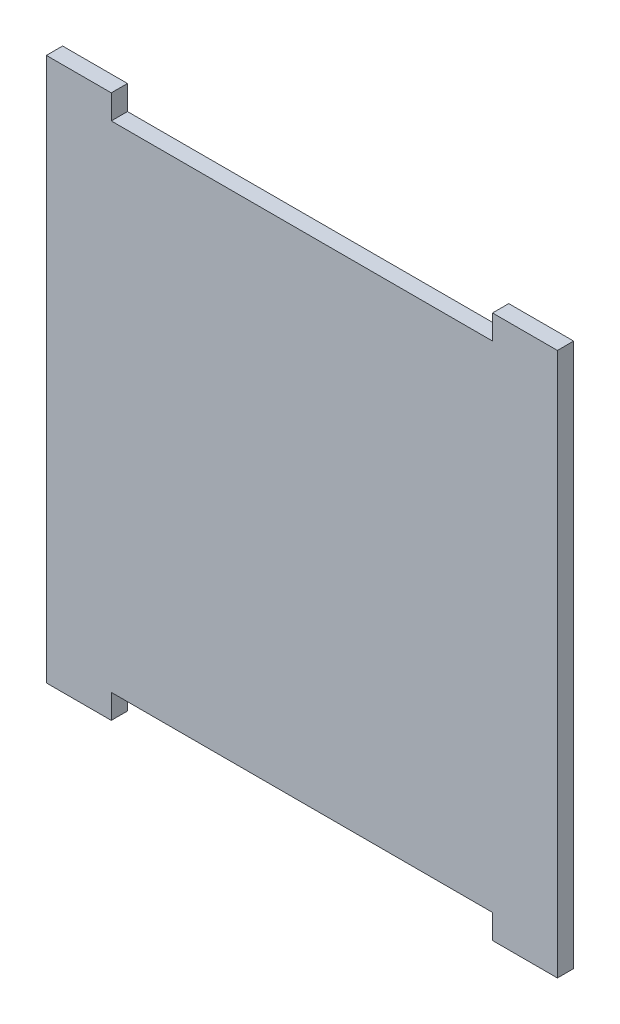
ISO-10303-21;
HEADER;
FILE_DESCRIPTION(('STEP AP214'),'2;1');
FILE_NAME('part.step','',(''),(''),'','','');
FILE_SCHEMA(('AUTOMOTIVE_DESIGN { 1 0 10303 214 1 1 1 1 }'));
ENDSEC;
DATA;
#1=APPLICATION_CONTEXT('core data for automotive mechanical design processes');
#2=APPLICATION_PROTOCOL_DEFINITION('international standard','automotive_design',2000,#1);
#3=PRODUCT_CONTEXT('',#1,'mechanical');
#4=PRODUCT('Part','Part','',(#3));
#5=PRODUCT_RELATED_PRODUCT_CATEGORY('part','',(#4));
#6=PRODUCT_DEFINITION_FORMATION('','',#4);
#7=PRODUCT_DEFINITION_CONTEXT('part definition',#1,'design');
#8=PRODUCT_DEFINITION('design','',#6,#7);
#9=PRODUCT_DEFINITION_SHAPE('','',#8);
#10=(LENGTH_UNIT() NAMED_UNIT(*) SI_UNIT(.MILLI.,.METRE.));
#11=(NAMED_UNIT(*) PLANE_ANGLE_UNIT() SI_UNIT($,.RADIAN.));
#12=(NAMED_UNIT(*) SI_UNIT($,.STERADIAN.) SOLID_ANGLE_UNIT());
#13=UNCERTAINTY_MEASURE_WITH_UNIT(LENGTH_MEASURE(1.E-05),#10,'distance_accuracy_value','');
#14=(GEOMETRIC_REPRESENTATION_CONTEXT(3) GLOBAL_UNCERTAINTY_ASSIGNED_CONTEXT((#13)) GLOBAL_UNIT_ASSIGNED_CONTEXT((#10,
#11,#12)) REPRESENTATION_CONTEXT('',''));
#15=CARTESIAN_POINT('',(0.,0.,0.));
#16=DIRECTION('',(0.,0.,1.));
#17=DIRECTION('',(1.,0.,0.));
#18=AXIS2_PLACEMENT_3D('',#15,#16,#17);
#19=CARTESIAN_POINT('',(-93.6625,106.3625,6.35));
#20=DIRECTION('',(0.,-1.,0.));
#21=DIRECTION('',(0.,0.,-1.));
#22=AXIS2_PLACEMENT_3D('',#19,#20,#21);
#23=PLANE('',#22);
#24=DIRECTION('',(0.,0.,1.));
#25=VECTOR('',#24,1.);
#26=CARTESIAN_POINT('',(-68.2625,106.3625,-0.00100000000000013));
#27=LINE('',#26,#25);
#28=CARTESIAN_POINT('',(-68.2625,106.3625,0.));
#29=VERTEX_POINT('',#28);
#30=CARTESIAN_POINT('',(-68.2625,106.3625,6.35));
#31=VERTEX_POINT('',#30);
#32=EDGE_CURVE('E138',#29,#31,#27,.T.);
#33=ORIENTED_EDGE('',*,*,#32,.F.);
#34=DIRECTION('',(-1.,0.,0.));
#35=VECTOR('',#34,1.);
#36=CARTESIAN_POINT('',(-93.6625,106.3625,0.));
#37=LINE('',#36,#35);
#38=CARTESIAN_POINT('',(-93.6625,106.3625,0.));
#39=VERTEX_POINT('',#38);
#40=EDGE_CURVE('E143',#29,#39,#37,.T.);
#41=ORIENTED_EDGE('',*,*,#40,.T.);
#42=DIRECTION('',(0.,0.,-1.));
#43=VECTOR('',#42,1.);
#44=CARTESIAN_POINT('',(-93.6625,106.3625,6.35));
#45=LINE('',#44,#43);
#46=CARTESIAN_POINT('',(-93.6625,106.3625,6.35));
#47=VERTEX_POINT('',#46);
#48=EDGE_CURVE('E195',#47,#39,#45,.T.);
#49=ORIENTED_EDGE('',*,*,#48,.F.);
#50=DIRECTION('',(-1.,0.,0.));
#51=VECTOR('',#50,1.);
#52=CARTESIAN_POINT('',(-93.6625,106.3625,6.35));
#53=LINE('',#52,#51);
#54=EDGE_CURVE('E191',#31,#47,#53,.T.);
#55=ORIENTED_EDGE('',*,*,#54,.F.);
#56=EDGE_LOOP('',(#33,#41,#49,#55));
#57=FACE_BOUND('',#56,.T.);
#58=ADVANCED_FACE('F31',(#57),#23,.F.);
#59=DIRECTION('',(0.,0.,1.));
#60=VECTOR('',#59,1.);
#61=CARTESIAN_POINT('',(80.9625,106.3625,-0.00100000000000013));
#62=LINE('',#61,#60);
#63=CARTESIAN_POINT('',(80.9625,106.3625,0.));
#64=VERTEX_POINT('',#63);
#65=CARTESIAN_POINT('',(80.9625,106.3625,6.35));
#66=VERTEX_POINT('',#65);
#67=EDGE_CURVE('E153',#64,#66,#62,.T.);
#68=ORIENTED_EDGE('',*,*,#67,.T.);
#69=CARTESIAN_POINT('',(106.3625,106.3625,6.35));
#70=VERTEX_POINT('',#69);
#71=EDGE_CURVE('E192',#70,#66,#53,.T.);
#72=ORIENTED_EDGE('',*,*,#71,.F.);
#73=DIRECTION('',(0.,0.,-1.));
#74=VECTOR('',#73,1.);
#75=CARTESIAN_POINT('',(106.3625,106.3625,6.35));
#76=LINE('',#75,#74);
#77=CARTESIAN_POINT('',(106.3625,106.3625,0.));
#78=VERTEX_POINT('',#77);
#79=EDGE_CURVE('E208',#70,#78,#76,.T.);
#80=ORIENTED_EDGE('',*,*,#79,.T.);
#81=EDGE_CURVE('E185',#78,#64,#37,.T.);
#82=ORIENTED_EDGE('',*,*,#81,.T.);
#83=EDGE_LOOP('',(#68,#72,#80,#82));
#84=FACE_BOUND('',#83,.T.);
#85=ADVANCED_FACE('F222',(#84),#23,.F.);
#86=CARTESIAN_POINT('',(-93.6625,106.3625,6.35));
#87=DIRECTION('',(0.,0.,-1.));
#88=DIRECTION('',(-1.,0.,0.));
#89=AXIS2_PLACEMENT_3D('',#86,#87,#88);
#90=PLANE('',#89);
#91=DIRECTION('',(0.,1.,0.));
#92=VECTOR('',#91,1.);
#93=CARTESIAN_POINT('',(-68.2625,106.3625,6.35));
#94=LINE('',#93,#92);
#95=CARTESIAN_POINT('',(-68.2625,96.8375,6.35));
#96=VERTEX_POINT('',#95);
#97=EDGE_CURVE('E126',#96,#31,#94,.T.);
#98=ORIENTED_EDGE('',*,*,#97,.T.);
#99=ORIENTED_EDGE('',*,*,#54,.T.);
#100=DIRECTION('',(0.,-1.,0.));
#101=VECTOR('',#100,1.);
#102=CARTESIAN_POINT('',(-93.6625,-106.3625,6.35));
#103=LINE('',#102,#101);
#104=CARTESIAN_POINT('',(-93.6625,-106.3625,6.35));
#105=VERTEX_POINT('',#104);
#106=EDGE_CURVE('E181',#47,#105,#103,.T.);
#107=ORIENTED_EDGE('',*,*,#106,.T.);
#108=DIRECTION('',(1.,0.,0.));
#109=VECTOR('',#108,1.);
#110=CARTESIAN_POINT('',(-93.6625,-106.3625,6.35));
#111=LINE('',#110,#109);
#112=CARTESIAN_POINT('',(-68.2625,-106.3625,6.35));
#113=VERTEX_POINT('',#112);
#114=EDGE_CURVE('E186',#105,#113,#111,.T.);
#115=ORIENTED_EDGE('',*,*,#114,.T.);
#116=DIRECTION('',(0.,-1.,0.));
#117=VECTOR('',#116,1.);
#118=CARTESIAN_POINT('',(-68.2625,-106.3625,6.35));
#119=LINE('',#118,#117);
#120=CARTESIAN_POINT('',(-68.2625,-96.8375,6.35));
#121=VERTEX_POINT('',#120);
#122=EDGE_CURVE('E165',#121,#113,#119,.T.);
#123=ORIENTED_EDGE('',*,*,#122,.F.);
#124=DIRECTION('',(-1.,0.,0.));
#125=VECTOR('',#124,1.);
#126=CARTESIAN_POINT('',(-68.2625,-96.8375,6.35));
#127=LINE('',#126,#125);
#128=CARTESIAN_POINT('',(80.9625,-96.8375,6.35));
#129=VERTEX_POINT('',#128);
#130=EDGE_CURVE('E169',#129,#121,#127,.T.);
#131=ORIENTED_EDGE('',*,*,#130,.F.);
#132=DIRECTION('',(0.,1.,0.));
#133=VECTOR('',#132,1.);
#134=CARTESIAN_POINT('',(80.9625,-106.3625,6.35));
#135=LINE('',#134,#133);
#136=CARTESIAN_POINT('',(80.9625,-106.3625,6.35));
#137=VERTEX_POINT('',#136);
#138=EDGE_CURVE('E167',#137,#129,#135,.T.);
#139=ORIENTED_EDGE('',*,*,#138,.F.);
#140=CARTESIAN_POINT('',(106.3625,-106.3625,6.35));
#141=VERTEX_POINT('',#140);
#142=EDGE_CURVE('E184',#137,#141,#111,.T.);
#143=ORIENTED_EDGE('',*,*,#142,.T.);
#144=DIRECTION('',(0.,1.,0.));
#145=VECTOR('',#144,1.);
#146=CARTESIAN_POINT('',(106.3625,-106.3625,6.35));
#147=LINE('',#146,#145);
#148=EDGE_CURVE('E189',#141,#70,#147,.T.);
#149=ORIENTED_EDGE('',*,*,#148,.T.);
#150=ORIENTED_EDGE('',*,*,#71,.T.);
#151=DIRECTION('',(0.,-1.,0.));
#152=VECTOR('',#151,1.);
#153=CARTESIAN_POINT('',(80.9625,106.3625,6.35));
#154=LINE('',#153,#152);
#155=CARTESIAN_POINT('',(80.9625,96.8375,6.35));
#156=VERTEX_POINT('',#155);
#157=EDGE_CURVE('E131',#66,#156,#154,.T.);
#158=ORIENTED_EDGE('',*,*,#157,.T.);
#159=DIRECTION('',(-1.,0.,0.));
#160=VECTOR('',#159,1.);
#161=CARTESIAN_POINT('',(-68.2625,96.8375,6.35));
#162=LINE('',#161,#160);
#163=EDGE_CURVE('E145',#156,#96,#162,.T.);
#164=ORIENTED_EDGE('',*,*,#163,.T.);
#165=EDGE_LOOP('',(#98,#99,#107,#115,#123,#131,#139,#143,#149,#150,#158,#164));
#166=FACE_BOUND('',#165,.T.);
#167=ADVANCED_FACE('F225',(#166),#90,.F.);
#168=CARTESIAN_POINT('',(-93.6625,106.3625,0.));
#169=DIRECTION('',(0.,0.,-1.));
#170=DIRECTION('',(-1.,0.,0.));
#171=AXIS2_PLACEMENT_3D('',#168,#169,#170);
#172=PLANE('',#171);
#173=ORIENTED_EDGE('',*,*,#40,.F.);
#174=DIRECTION('',(0.,1.,0.));
#175=VECTOR('',#174,1.);
#176=CARTESIAN_POINT('',(-68.2625,106.3625,0.));
#177=LINE('',#176,#175);
#178=CARTESIAN_POINT('',(-68.2625,96.8375,0.));
#179=VERTEX_POINT('',#178);
#180=EDGE_CURVE('E123',#179,#29,#177,.T.);
#181=ORIENTED_EDGE('',*,*,#180,.F.);
#182=DIRECTION('',(-1.,0.,0.));
#183=VECTOR('',#182,1.);
#184=CARTESIAN_POINT('',(-68.2625,96.8375,0.));
#185=LINE('',#184,#183);
#186=CARTESIAN_POINT('',(80.9625,96.8375,0.));
#187=VERTEX_POINT('',#186);
#188=EDGE_CURVE('E134',#187,#179,#185,.T.);
#189=ORIENTED_EDGE('',*,*,#188,.F.);
#190=DIRECTION('',(0.,-1.,0.));
#191=VECTOR('',#190,1.);
#192=CARTESIAN_POINT('',(80.9625,106.3625,0.));
#193=LINE('',#192,#191);
#194=EDGE_CURVE('E46',#64,#187,#193,.T.);
#195=ORIENTED_EDGE('',*,*,#194,.F.);
#196=ORIENTED_EDGE('',*,*,#81,.F.);
#197=DIRECTION('',(0.,1.,0.));
#198=VECTOR('',#197,1.);
#199=CARTESIAN_POINT('',(106.3625,-106.3625,0.));
#200=LINE('',#199,#198);
#201=CARTESIAN_POINT('',(106.3625,-106.3625,0.));
#202=VERTEX_POINT('',#201);
#203=EDGE_CURVE('E202',#202,#78,#200,.T.);
#204=ORIENTED_EDGE('',*,*,#203,.F.);
#205=DIRECTION('',(1.,0.,0.));
#206=VECTOR('',#205,1.);
#207=CARTESIAN_POINT('',(-93.6625,-106.3625,0.));
#208=LINE('',#207,#206);
#209=CARTESIAN_POINT('',(80.9625,-106.3625,0.));
#210=VERTEX_POINT('',#209);
#211=EDGE_CURVE('E198',#210,#202,#208,.T.);
#212=ORIENTED_EDGE('',*,*,#211,.F.);
#213=DIRECTION('',(0.,1.,0.));
#214=VECTOR('',#213,1.);
#215=CARTESIAN_POINT('',(80.9625,-106.3625,0.));
#216=LINE('',#215,#214);
#217=CARTESIAN_POINT('',(80.9625,-96.8375,0.));
#218=VERTEX_POINT('',#217);
#219=EDGE_CURVE('E137',#210,#218,#216,.T.);
#220=ORIENTED_EDGE('',*,*,#219,.T.);
#221=DIRECTION('',(-1.,0.,0.));
#222=VECTOR('',#221,1.);
#223=CARTESIAN_POINT('',(-68.2625,-96.8375,0.));
#224=LINE('',#223,#222);
#225=CARTESIAN_POINT('',(-68.2625,-96.8375,0.));
#226=VERTEX_POINT('',#225);
#227=EDGE_CURVE('E159',#218,#226,#224,.T.);
#228=ORIENTED_EDGE('',*,*,#227,.T.);
#229=DIRECTION('',(0.,-1.,0.));
#230=VECTOR('',#229,1.);
#231=CARTESIAN_POINT('',(-68.2625,-106.3625,0.));
#232=LINE('',#231,#230);
#233=CARTESIAN_POINT('',(-68.2625,-106.3625,0.));
#234=VERTEX_POINT('',#233);
#235=EDGE_CURVE('E162',#226,#234,#232,.T.);
#236=ORIENTED_EDGE('',*,*,#235,.T.);
#237=CARTESIAN_POINT('',(-93.6625,-106.3625,0.));
#238=VERTEX_POINT('',#237);
#239=EDGE_CURVE('E199',#238,#234,#208,.T.);
#240=ORIENTED_EDGE('',*,*,#239,.F.);
#241=DIRECTION('',(0.,-1.,0.));
#242=VECTOR('',#241,1.);
#243=CARTESIAN_POINT('',(-93.6625,-106.3625,0.));
#244=LINE('',#243,#242);
#245=EDGE_CURVE('E175',#39,#238,#244,.T.);
#246=ORIENTED_EDGE('',*,*,#245,.F.);
#247=EDGE_LOOP('',(#173,#181,#189,#195,#196,#204,#212,#220,#228,#236,#240,#246));
#248=FACE_BOUND('',#247,.T.);
#249=ADVANCED_FACE('F141',(#248),#172,.T.);
#250=CARTESIAN_POINT('',(-93.6625,-106.3625,6.35));
#251=DIRECTION('',(0.,1.,0.));
#252=DIRECTION('',(0.,0.,1.));
#253=AXIS2_PLACEMENT_3D('',#250,#251,#252);
#254=PLANE('',#253);
#255=ORIENTED_EDGE('',*,*,#239,.T.);
#256=DIRECTION('',(0.,0.,1.));
#257=VECTOR('',#256,1.);
#258=CARTESIAN_POINT('',(-68.2625,-106.3625,-0.00100000000000013));
#259=LINE('',#258,#257);
#260=EDGE_CURVE('E172',#234,#113,#259,.T.);
#261=ORIENTED_EDGE('',*,*,#260,.T.);
#262=ORIENTED_EDGE('',*,*,#114,.F.);
#263=DIRECTION('',(0.,0.,-1.));
#264=VECTOR('',#263,1.);
#265=CARTESIAN_POINT('',(-93.6625,-106.3625,6.35));
#266=LINE('',#265,#264);
#267=EDGE_CURVE('E11',#105,#238,#266,.T.);
#268=ORIENTED_EDGE('',*,*,#267,.T.);
#269=EDGE_LOOP('',(#255,#261,#262,#268));
#270=FACE_BOUND('',#269,.T.);
#271=ADVANCED_FACE('F238',(#270),#254,.F.);
#272=CARTESIAN_POINT('',(-93.6625,-106.3625,6.35));
#273=DIRECTION('',(1.,0.,0.));
#274=DIRECTION('',(0.,0.,-1.));
#275=AXIS2_PLACEMENT_3D('',#272,#273,#274);
#276=PLANE('',#275);
#277=ORIENTED_EDGE('',*,*,#245,.T.);
#278=ORIENTED_EDGE('',*,*,#267,.F.);
#279=ORIENTED_EDGE('',*,*,#106,.F.);
#280=ORIENTED_EDGE('',*,*,#48,.T.);
#281=EDGE_LOOP('',(#277,#278,#279,#280));
#282=FACE_BOUND('',#281,.T.);
#283=ADVANCED_FACE('F33',(#282),#276,.F.);
#284=ORIENTED_EDGE('',*,*,#142,.F.);
#285=DIRECTION('',(0.,0.,1.));
#286=VECTOR('',#285,1.);
#287=CARTESIAN_POINT('',(80.9625,-106.3625,-0.00100000000000013));
#288=LINE('',#287,#286);
#289=EDGE_CURVE('E177',#210,#137,#288,.T.);
#290=ORIENTED_EDGE('',*,*,#289,.F.);
#291=ORIENTED_EDGE('',*,*,#211,.T.);
#292=DIRECTION('',(0.,0.,-1.));
#293=VECTOR('',#292,1.);
#294=CARTESIAN_POINT('',(106.3625,-106.3625,6.35));
#295=LINE('',#294,#293);
#296=EDGE_CURVE('E39',#141,#202,#295,.T.);
#297=ORIENTED_EDGE('',*,*,#296,.F.);
#298=EDGE_LOOP('',(#284,#290,#291,#297));
#299=FACE_BOUND('',#298,.T.);
#300=ADVANCED_FACE('F229',(#299),#254,.F.);
#301=CARTESIAN_POINT('',(106.3625,-106.3625,6.35));
#302=DIRECTION('',(-1.,0.,0.));
#303=DIRECTION('',(0.,0.,1.));
#304=AXIS2_PLACEMENT_3D('',#301,#302,#303);
#305=PLANE('',#304);
#306=ORIENTED_EDGE('',*,*,#203,.T.);
#307=ORIENTED_EDGE('',*,*,#79,.F.);
#308=ORIENTED_EDGE('',*,*,#148,.F.);
#309=ORIENTED_EDGE('',*,*,#296,.T.);
#310=EDGE_LOOP('',(#306,#307,#308,#309));
#311=FACE_BOUND('',#310,.T.);
#312=ADVANCED_FACE('F215',(#311),#305,.F.);
#313=CARTESIAN_POINT('',(-68.2625,-106.3625,-0.00100000000000013));
#314=DIRECTION('',(-1.,0.,0.));
#315=DIRECTION('',(0.,-1.,0.));
#316=AXIS2_PLACEMENT_3D('',#313,#314,#315);
#317=PLANE('',#316);
#318=DIRECTION('',(0.,0.,1.));
#319=VECTOR('',#318,1.);
#320=CARTESIAN_POINT('',(-68.2625,-96.8375,-0.00100000000000013));
#321=LINE('',#320,#319);
#322=EDGE_CURVE('E173',#226,#121,#321,.T.);
#323=ORIENTED_EDGE('',*,*,#322,.T.);
#324=ORIENTED_EDGE('',*,*,#122,.T.);
#325=ORIENTED_EDGE('',*,*,#260,.F.);
#326=ORIENTED_EDGE('',*,*,#235,.F.);
#327=EDGE_LOOP('',(#323,#324,#325,#326));
#328=FACE_BOUND('',#327,.T.);
#329=ADVANCED_FACE('F236',(#328),#317,.F.);
#330=CARTESIAN_POINT('',(-68.2625,-96.8375,-0.00100000000000013));
#331=DIRECTION('',(0.,1.,0.));
#332=DIRECTION('',(-1.,0.,0.));
#333=AXIS2_PLACEMENT_3D('',#330,#331,#332);
#334=PLANE('',#333);
#335=DIRECTION('',(0.,0.,1.));
#336=VECTOR('',#335,1.);
#337=CARTESIAN_POINT('',(80.9625,-96.8375,-0.00100000000000013));
#338=LINE('',#337,#336);
#339=EDGE_CURVE('E54',#218,#129,#338,.T.);
#340=ORIENTED_EDGE('',*,*,#339,.T.);
#341=ORIENTED_EDGE('',*,*,#130,.T.);
#342=ORIENTED_EDGE('',*,*,#322,.F.);
#343=ORIENTED_EDGE('',*,*,#227,.F.);
#344=EDGE_LOOP('',(#340,#341,#342,#343));
#345=FACE_BOUND('',#344,.T.);
#346=ADVANCED_FACE('F233',(#345),#334,.F.);
#347=CARTESIAN_POINT('',(80.9625,-106.3625,-0.00100000000000013));
#348=DIRECTION('',(1.,0.,0.));
#349=DIRECTION('',(0.,0.,-1.));
#350=AXIS2_PLACEMENT_3D('',#347,#348,#349);
#351=PLANE('',#350);
#352=ORIENTED_EDGE('',*,*,#289,.T.);
#353=ORIENTED_EDGE('',*,*,#138,.T.);
#354=ORIENTED_EDGE('',*,*,#339,.F.);
#355=ORIENTED_EDGE('',*,*,#219,.F.);
#356=EDGE_LOOP('',(#352,#353,#354,#355));
#357=FACE_BOUND('',#356,.T.);
#358=ADVANCED_FACE('F230',(#357),#351,.F.);
#359=CARTESIAN_POINT('',(-68.2625,106.3625,-0.00100000000000013));
#360=DIRECTION('',(1.,0.,0.));
#361=DIRECTION('',(0.,1.,0.));
#362=AXIS2_PLACEMENT_3D('',#359,#360,#361);
#363=PLANE('',#362);
#364=ORIENTED_EDGE('',*,*,#180,.T.);
#365=ORIENTED_EDGE('',*,*,#32,.T.);
#366=ORIENTED_EDGE('',*,*,#97,.F.);
#367=DIRECTION('',(0.,0.,1.));
#368=VECTOR('',#367,1.);
#369=CARTESIAN_POINT('',(-68.2625,96.8375,-0.00100000000000013));
#370=LINE('',#369,#368);
#371=EDGE_CURVE('E119',#179,#96,#370,.T.);
#372=ORIENTED_EDGE('',*,*,#371,.F.);
#373=EDGE_LOOP('',(#364,#365,#366,#372));
#374=FACE_BOUND('',#373,.T.);
#375=ADVANCED_FACE('F121',(#374),#363,.T.);
#376=CARTESIAN_POINT('',(80.9625,106.3625,-0.00100000000000013));
#377=DIRECTION('',(-1.,0.,0.));
#378=DIRECTION('',(0.,0.,1.));
#379=AXIS2_PLACEMENT_3D('',#376,#377,#378);
#380=PLANE('',#379);
#381=ORIENTED_EDGE('',*,*,#194,.T.);
#382=DIRECTION('',(0.,0.,1.));
#383=VECTOR('',#382,1.);
#384=CARTESIAN_POINT('',(80.9625,96.8375,-0.00100000000000013));
#385=LINE('',#384,#383);
#386=EDGE_CURVE('E130',#187,#156,#385,.T.);
#387=ORIENTED_EDGE('',*,*,#386,.T.);
#388=ORIENTED_EDGE('',*,*,#157,.F.);
#389=ORIENTED_EDGE('',*,*,#67,.F.);
#390=EDGE_LOOP('',(#381,#387,#388,#389));
#391=FACE_BOUND('',#390,.T.);
#392=ADVANCED_FACE('F276',(#391),#380,.T.);
#393=CARTESIAN_POINT('',(-68.2625,96.8375,-0.00100000000000013));
#394=DIRECTION('',(0.,1.,0.));
#395=DIRECTION('',(-1.,0.,0.));
#396=AXIS2_PLACEMENT_3D('',#393,#394,#395);
#397=PLANE('',#396);
#398=ORIENTED_EDGE('',*,*,#188,.T.);
#399=ORIENTED_EDGE('',*,*,#371,.T.);
#400=ORIENTED_EDGE('',*,*,#163,.F.);
#401=ORIENTED_EDGE('',*,*,#386,.F.);
#402=EDGE_LOOP('',(#398,#399,#400,#401));
#403=FACE_BOUND('',#402,.T.);
#404=ADVANCED_FACE('F135',(#403),#397,.T.);
#405=CLOSED_SHELL('',(#58,#85,#167,#249,#271,#283,#300,#312,#329,#346,#358,#375,#392,#404));
#406=MANIFOLD_SOLID_BREP('B2',#405);
#407=ADVANCED_BREP_SHAPE_REPRESENTATION('',(#18,#406),#14);
#408=SHAPE_DEFINITION_REPRESENTATION(#9,#407);
ENDSEC;
END-ISO-10303-21;
